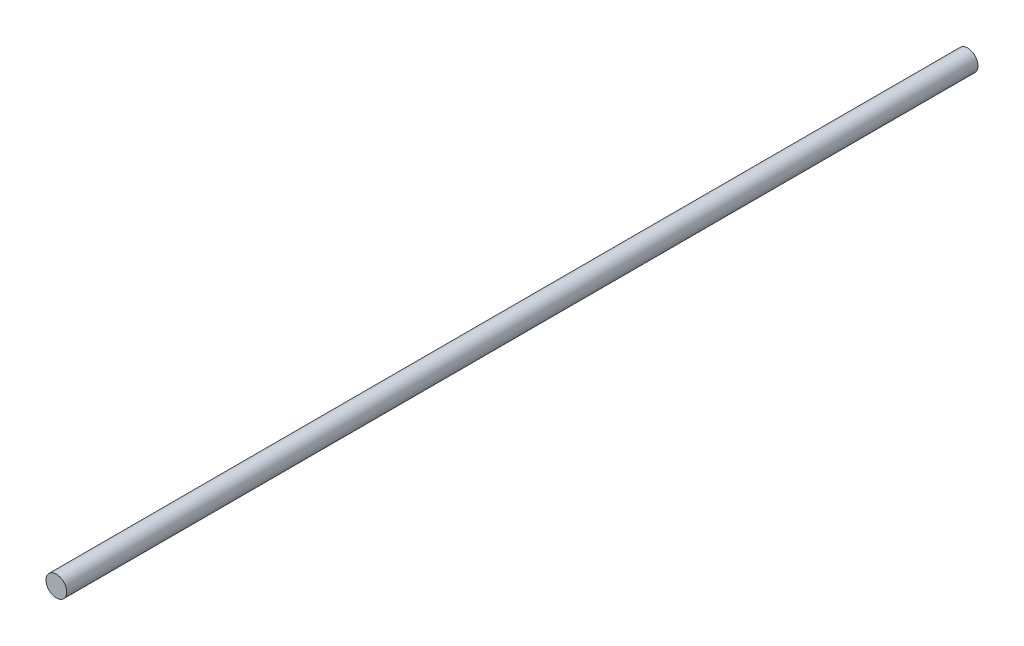
ISO-10303-21;
HEADER;
FILE_DESCRIPTION(('STEP AP214'),'2;1');
FILE_NAME('part.step','',(''),(''),'','','');
FILE_SCHEMA(('AUTOMOTIVE_DESIGN { 1 0 10303 214 1 1 1 1 }'));
ENDSEC;
DATA;
#1=APPLICATION_CONTEXT('core data for automotive mechanical design processes');
#2=APPLICATION_PROTOCOL_DEFINITION('international standard','automotive_design',2000,#1);
#3=PRODUCT_CONTEXT('',#1,'mechanical');
#4=PRODUCT('Part','Part','',(#3));
#5=PRODUCT_RELATED_PRODUCT_CATEGORY('part','',(#4));
#6=PRODUCT_DEFINITION_FORMATION('','',#4);
#7=PRODUCT_DEFINITION_CONTEXT('part definition',#1,'design');
#8=PRODUCT_DEFINITION('design','',#6,#7);
#9=PRODUCT_DEFINITION_SHAPE('','',#8);
#10=(LENGTH_UNIT() NAMED_UNIT(*) SI_UNIT(.MILLI.,.METRE.));
#11=(NAMED_UNIT(*) PLANE_ANGLE_UNIT() SI_UNIT($,.RADIAN.));
#12=(NAMED_UNIT(*) SI_UNIT($,.STERADIAN.) SOLID_ANGLE_UNIT());
#13=UNCERTAINTY_MEASURE_WITH_UNIT(LENGTH_MEASURE(1.E-05),#10,'distance_accuracy_value','');
#14=(GEOMETRIC_REPRESENTATION_CONTEXT(3) GLOBAL_UNCERTAINTY_ASSIGNED_CONTEXT((#13)) GLOBAL_UNIT_ASSIGNED_CONTEXT((#10,
#11,#12)) REPRESENTATION_CONTEXT('',''));
#15=CARTESIAN_POINT('',(0.,0.,0.));
#16=DIRECTION('',(0.,0.,1.));
#17=DIRECTION('',(1.,0.,0.));
#18=AXIS2_PLACEMENT_3D('',#15,#16,#17);
#19=CARTESIAN_POINT('',(0.,0.,279.4));
#20=DIRECTION('',(0.,0.,-1.));
#21=DIRECTION('',(-1.,0.,0.));
#22=AXIS2_PLACEMENT_3D('',#19,#20,#21);
#23=CYLINDRICAL_SURFACE('',#22,3.175);
#24=CARTESIAN_POINT('',(0.,0.,279.4));
#25=DIRECTION('',(0.,0.,1.));
#26=DIRECTION('',(1.,0.,0.));
#27=AXIS2_PLACEMENT_3D('',#24,#25,#26);
#28=CIRCLE('',#27,3.175);
#29=CARTESIAN_POINT('',(3.175,0.,279.4));
#30=VERTEX_POINT('',#29);
#31=EDGE_CURVE('E10',#30,#30,#28,.T.);
#32=ORIENTED_EDGE('',*,*,#31,.F.);
#33=EDGE_LOOP('',(#32));
#34=FACE_BOUND('',#33,.T.);
#35=CARTESIAN_POINT('',(0.,0.,0.));
#36=DIRECTION('',(0.,0.,1.));
#37=DIRECTION('',(1.,0.,0.));
#38=AXIS2_PLACEMENT_3D('',#35,#36,#37);
#39=CIRCLE('',#38,3.175);
#40=CARTESIAN_POINT('',(3.175,0.,0.));
#41=VERTEX_POINT('',#40);
#42=EDGE_CURVE('E40',#41,#41,#39,.T.);
#43=ORIENTED_EDGE('',*,*,#42,.T.);
#44=EDGE_LOOP('',(#43));
#45=FACE_BOUND('',#44,.T.);
#46=ADVANCED_FACE('F37',(#34,#45),#23,.T.);
#47=CARTESIAN_POINT('',(0.,0.,279.4));
#48=DIRECTION('',(0.,0.,1.));
#49=DIRECTION('',(1.,0.,0.));
#50=AXIS2_PLACEMENT_3D('',#47,#48,#49);
#51=PLANE('',#50);
#52=ORIENTED_EDGE('',*,*,#31,.T.);
#53=EDGE_LOOP('',(#52));
#54=FACE_BOUND('',#53,.T.);
#55=ADVANCED_FACE('F54',(#54),#51,.T.);
#56=CARTESIAN_POINT('',(0.,0.,0.));
#57=DIRECTION('',(0.,0.,1.));
#58=DIRECTION('',(1.,0.,0.));
#59=AXIS2_PLACEMENT_3D('',#56,#57,#58);
#60=PLANE('',#59);
#61=ORIENTED_EDGE('',*,*,#42,.F.);
#62=EDGE_LOOP('',(#61));
#63=FACE_BOUND('',#62,.T.);
#64=ADVANCED_FACE('F52',(#63),#60,.F.);
#65=CLOSED_SHELL('',(#46,#55,#64));
#66=MANIFOLD_SOLID_BREP('B2',#65);
#67=ADVANCED_BREP_SHAPE_REPRESENTATION('',(#18,#66),#14);
#68=SHAPE_DEFINITION_REPRESENTATION(#9,#67);
ENDSEC;
END-ISO-10303-21;
